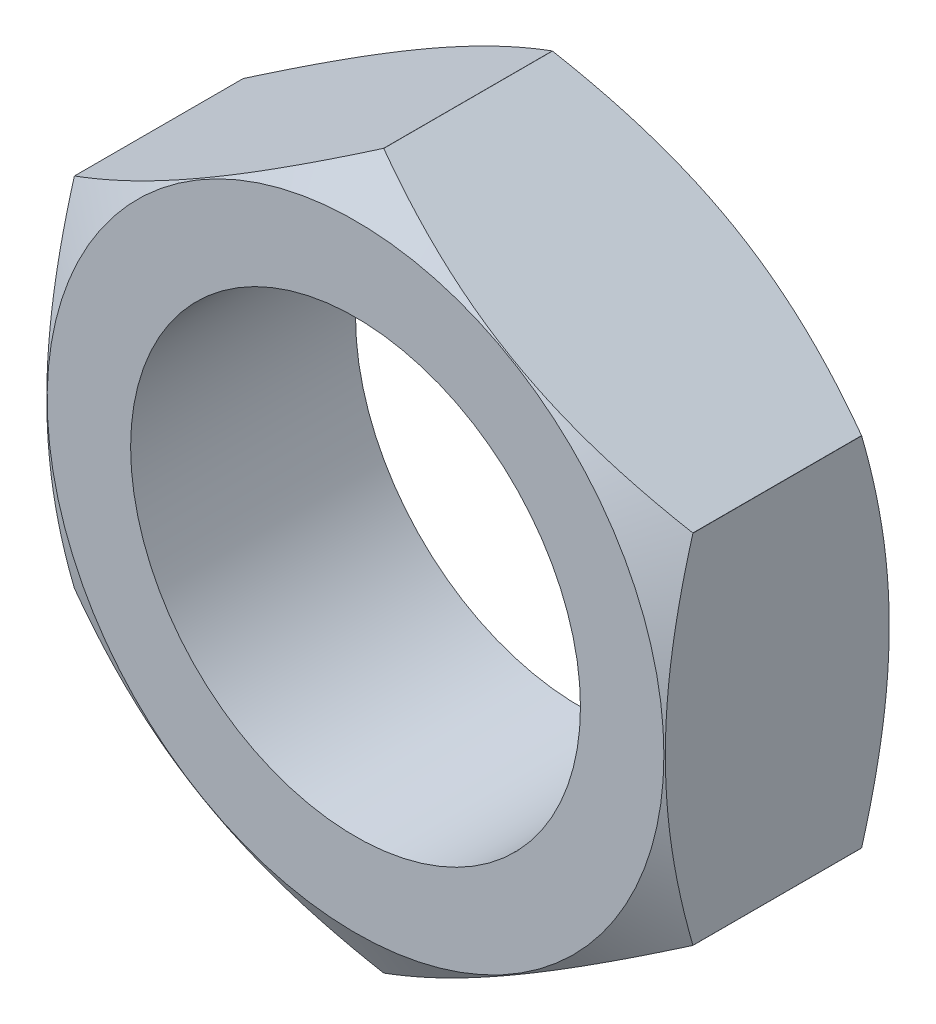
ISO-10303-21;
HEADER;
FILE_DESCRIPTION(('STEP AP214'),'2;1');
FILE_NAME('part.step','',(''),(''),'','','');
FILE_SCHEMA(('AUTOMOTIVE_DESIGN { 1 0 10303 214 1 1 1 1 }'));
ENDSEC;
DATA;
#1=APPLICATION_CONTEXT('core data for automotive mechanical design processes');
#2=APPLICATION_PROTOCOL_DEFINITION('international standard','automotive_design',2000,#1);
#3=PRODUCT_CONTEXT('',#1,'mechanical');
#4=PRODUCT('Part','Part','',(#3));
#5=PRODUCT_RELATED_PRODUCT_CATEGORY('part','',(#4));
#6=PRODUCT_DEFINITION_FORMATION('','',#4);
#7=PRODUCT_DEFINITION_CONTEXT('part definition',#1,'design');
#8=PRODUCT_DEFINITION('design','',#6,#7);
#9=PRODUCT_DEFINITION_SHAPE('','',#8);
#10=(LENGTH_UNIT() NAMED_UNIT(*) SI_UNIT(.MILLI.,.METRE.));
#11=(NAMED_UNIT(*) PLANE_ANGLE_UNIT() SI_UNIT($,.RADIAN.));
#12=(NAMED_UNIT(*) SI_UNIT($,.STERADIAN.) SOLID_ANGLE_UNIT());
#13=UNCERTAINTY_MEASURE_WITH_UNIT(LENGTH_MEASURE(1.E-05),#10,'distance_accuracy_value','');
#14=(GEOMETRIC_REPRESENTATION_CONTEXT(3) GLOBAL_UNCERTAINTY_ASSIGNED_CONTEXT((#13)) GLOBAL_UNIT_ASSIGNED_CONTEXT((#10,
#11,#12)) REPRESENTATION_CONTEXT('',''));
#15=CARTESIAN_POINT('',(0.,0.,0.));
#16=DIRECTION('',(0.,0.,1.));
#17=DIRECTION('',(1.,0.,0.));
#18=AXIS2_PLACEMENT_3D('',#15,#16,#17);
#19=CARTESIAN_POINT('',(0.,0.,4.));
#20=DIRECTION('',(0.,0.,-1.));
#21=DIRECTION('',(-1.,0.,0.));
#22=AXIS2_PLACEMENT_3D('',#19,#20,#21);
#23=CYLINDRICAL_SURFACE('',#22,6.35);
#24=DIRECTION('',(0.,0.,-1.));
#25=VECTOR('',#24,1.);
#26=CARTESIAN_POINT('',(0.00147766972870235,-6.34999982807025,4.));
#27=LINE('',#26,#25);
#28=CARTESIAN_POINT('',(0.00147766972870077,-6.34999982807025,3.49999999999999));
#29=VERTEX_POINT('',#28);
#30=CARTESIAN_POINT('',(0.00147766972870235,-6.34999982807025,0.500000000000006));
#31=VERTEX_POINT('',#30);
#32=EDGE_CURVE('E146',#29,#31,#27,.T.);
#33=ORIENTED_EDGE('',*,*,#32,.F.);
#34=CARTESIAN_POINT('',(0.,0.,3.49999999999999));
#35=DIRECTION('',(0.,0.,1.));
#36=DIRECTION('',(1.,0.,0.));
#37=AXIS2_PLACEMENT_3D('',#34,#35,#36);
#38=CIRCLE('',#37,6.35);
#39=CARTESIAN_POINT('',(-0.00147766972869454,-6.34999982807025,3.49999999999999));
#40=VERTEX_POINT('',#39);
#41=EDGE_CURVE('E135',#29,#40,#38,.F.);
#42=ORIENTED_EDGE('',*,*,#41,.T.);
#43=DIRECTION('',(0.,0.,-1.));
#44=VECTOR('',#43,1.);
#45=CARTESIAN_POINT('',(-0.00147766972869454,-6.34999982807025,4.));
#46=LINE('',#45,#44);
#47=CARTESIAN_POINT('',(-0.00147766972869454,-6.34999982807025,0.500000000000006));
#48=VERTEX_POINT('',#47);
#49=EDGE_CURVE('E420',#48,#40,#46,.F.);
#50=ORIENTED_EDGE('',*,*,#49,.F.);
#51=CARTESIAN_POINT('',(0.,0.,0.500000000000006));
#52=DIRECTION('',(0.,0.,1.));
#53=DIRECTION('',(1.,0.,0.));
#54=AXIS2_PLACEMENT_3D('',#51,#52,#53);
#55=CIRCLE('',#54,6.35);
#56=EDGE_CURVE('E134',#48,#31,#55,.T.);
#57=ORIENTED_EDGE('',*,*,#56,.T.);
#58=EDGE_LOOP('',(#33,#42,#50,#57));
#59=FACE_BOUND('',#58,.T.);
#60=ADVANCED_FACE('F17',(#59),#23,.T.);
#61=DIRECTION('',(0.,0.,-1.));
#62=VECTOR('',#61,1.);
#63=CARTESIAN_POINT('',(5.4985223302713,-3.17627961355859,4.));
#64=LINE('',#63,#62);
#65=CARTESIAN_POINT('',(5.4985223302713,-3.17627961355859,0.500000000000006));
#66=VERTEX_POINT('',#65);
#67=CARTESIAN_POINT('',(5.4985223302713,-3.17627961355858,3.49999999999999));
#68=VERTEX_POINT('',#67);
#69=EDGE_CURVE('E155',#66,#68,#64,.F.);
#70=ORIENTED_EDGE('',*,*,#69,.F.);
#71=CARTESIAN_POINT('',(5.5,-3.17372021451167,0.500000000000006));
#72=VERTEX_POINT('',#71);
#73=EDGE_CURVE('E128',#66,#72,#55,.T.);
#74=ORIENTED_EDGE('',*,*,#73,.T.);
#75=DIRECTION('',(0.,0.,-1.));
#76=VECTOR('',#75,1.);
#77=CARTESIAN_POINT('',(5.5,-3.17372021451167,4.));
#78=LINE('',#77,#76);
#79=CARTESIAN_POINT('',(5.5,-3.17372021451167,3.49999999999999));
#80=VERTEX_POINT('',#79);
#81=EDGE_CURVE('E115',#80,#72,#78,.T.);
#82=ORIENTED_EDGE('',*,*,#81,.F.);
#83=EDGE_CURVE('E130',#80,#68,#38,.F.);
#84=ORIENTED_EDGE('',*,*,#83,.T.);
#85=EDGE_LOOP('',(#70,#74,#82,#84));
#86=FACE_BOUND('',#85,.T.);
#87=ADVANCED_FACE('F122',(#86),#23,.T.);
#88=DIRECTION('',(0.,0.,-1.));
#89=VECTOR('',#88,1.);
#90=CARTESIAN_POINT('',(-5.4985223302713,-3.17627961355858,4.));
#91=LINE('',#90,#89);
#92=CARTESIAN_POINT('',(-5.4985223302713,-3.17627961355858,3.49999999999999));
#93=VERTEX_POINT('',#92);
#94=CARTESIAN_POINT('',(-5.4985223302713,-3.17627961355858,0.500000000000006));
#95=VERTEX_POINT('',#94);
#96=EDGE_CURVE('E272',#93,#95,#91,.T.);
#97=ORIENTED_EDGE('',*,*,#96,.F.);
#98=CARTESIAN_POINT('',(-5.5,-3.17372021451167,3.49999999999999));
#99=VERTEX_POINT('',#98);
#100=EDGE_CURVE('E137',#93,#99,#38,.F.);
#101=ORIENTED_EDGE('',*,*,#100,.T.);
#102=DIRECTION('',(0.,0.,-1.));
#103=VECTOR('',#102,1.);
#104=CARTESIAN_POINT('',(-5.5,-3.17372021451167,4.));
#105=LINE('',#104,#103);
#106=CARTESIAN_POINT('',(-5.5,-3.17372021451167,0.500000000000006));
#107=VERTEX_POINT('',#106);
#108=EDGE_CURVE('E217',#107,#99,#105,.F.);
#109=ORIENTED_EDGE('',*,*,#108,.F.);
#110=EDGE_CURVE('E426',#107,#95,#55,.T.);
#111=ORIENTED_EDGE('',*,*,#110,.T.);
#112=EDGE_LOOP('',(#97,#101,#109,#111));
#113=FACE_BOUND('',#112,.T.);
#114=ADVANCED_FACE('F190',(#113),#23,.T.);
#115=DIRECTION('',(0.,0.,-1.));
#116=VECTOR('',#115,1.);
#117=CARTESIAN_POINT('',(-5.5,3.17372021451167,4.));
#118=LINE('',#117,#116);
#119=CARTESIAN_POINT('',(-5.5,3.17372021451167,3.49999999999999));
#120=VERTEX_POINT('',#119);
#121=CARTESIAN_POINT('',(-5.5,3.17372021451167,0.500000000000006));
#122=VERTEX_POINT('',#121);
#123=EDGE_CURVE('E409',#120,#122,#118,.T.);
#124=ORIENTED_EDGE('',*,*,#123,.F.);
#125=CARTESIAN_POINT('',(-5.4985223302713,3.17627961355858,3.49999999999999));
#126=VERTEX_POINT('',#125);
#127=EDGE_CURVE('E148',#120,#126,#38,.F.);
#128=ORIENTED_EDGE('',*,*,#127,.T.);
#129=DIRECTION('',(0.,0.,-1.));
#130=VECTOR('',#129,1.);
#131=CARTESIAN_POINT('',(-5.4985223302713,3.17627961355858,4.));
#132=LINE('',#131,#130);
#133=CARTESIAN_POINT('',(-5.4985223302713,3.17627961355858,0.500000000000006));
#134=VERTEX_POINT('',#133);
#135=EDGE_CURVE('E216',#134,#126,#132,.F.);
#136=ORIENTED_EDGE('',*,*,#135,.F.);
#137=EDGE_CURVE('E416',#134,#122,#55,.T.);
#138=ORIENTED_EDGE('',*,*,#137,.T.);
#139=EDGE_LOOP('',(#124,#128,#136,#138));
#140=FACE_BOUND('',#139,.T.);
#141=ADVANCED_FACE('F198',(#140),#23,.T.);
#142=DIRECTION('',(0.,0.,-1.));
#143=VECTOR('',#142,1.);
#144=CARTESIAN_POINT('',(-0.00147766972869888,6.34999982807025,4.));
#145=LINE('',#144,#143);
#146=CARTESIAN_POINT('',(-0.00147766972869848,6.34999982807025,3.49999999999999));
#147=VERTEX_POINT('',#146);
#148=CARTESIAN_POINT('',(-0.00147766972869888,6.34999982807025,0.500000000000006));
#149=VERTEX_POINT('',#148);
#150=EDGE_CURVE('E211',#147,#149,#145,.T.);
#151=ORIENTED_EDGE('',*,*,#150,.F.);
#152=CARTESIAN_POINT('',(0.00147766972869454,6.34999982807025,3.49999999999999));
#153=VERTEX_POINT('',#152);
#154=EDGE_CURVE('E143',#147,#153,#38,.F.);
#155=ORIENTED_EDGE('',*,*,#154,.T.);
#156=DIRECTION('',(0.,0.,-1.));
#157=VECTOR('',#156,1.);
#158=CARTESIAN_POINT('',(0.00147766972869454,6.34999982807025,4.));
#159=LINE('',#158,#157);
#160=CARTESIAN_POINT('',(0.00147766972869454,6.34999982807025,0.500000000000006));
#161=VERTEX_POINT('',#160);
#162=EDGE_CURVE('E46',#161,#153,#159,.F.);
#163=ORIENTED_EDGE('',*,*,#162,.F.);
#164=EDGE_CURVE('E215',#161,#149,#55,.T.);
#165=ORIENTED_EDGE('',*,*,#164,.T.);
#166=EDGE_LOOP('',(#151,#155,#163,#165));
#167=FACE_BOUND('',#166,.T.);
#168=ADVANCED_FACE('F189',(#167),#23,.T.);
#169=DIRECTION('',(0.,0.,-1.));
#170=VECTOR('',#169,1.);
#171=CARTESIAN_POINT('',(5.4985223302713,3.17627961355858,4.));
#172=LINE('',#171,#170);
#173=CARTESIAN_POINT('',(5.4985223302713,3.17627961355858,3.49999999999999));
#174=VERTEX_POINT('',#173);
#175=CARTESIAN_POINT('',(5.4985223302713,3.17627961355858,0.500000000000006));
#176=VERTEX_POINT('',#175);
#177=EDGE_CURVE('E200',#174,#176,#172,.T.);
#178=ORIENTED_EDGE('',*,*,#177,.F.);
#179=CARTESIAN_POINT('',(5.5,3.17372021451167,3.49999999999999));
#180=VERTEX_POINT('',#179);
#181=EDGE_CURVE('E133',#174,#180,#38,.F.);
#182=ORIENTED_EDGE('',*,*,#181,.T.);
#183=DIRECTION('',(0.,0.,-1.));
#184=VECTOR('',#183,1.);
#185=CARTESIAN_POINT('',(5.5,3.17372021451167,4.));
#186=LINE('',#185,#184);
#187=CARTESIAN_POINT('',(5.5,3.17372021451167,0.500000000000006));
#188=VERTEX_POINT('',#187);
#189=EDGE_CURVE('E36',#188,#180,#186,.F.);
#190=ORIENTED_EDGE('',*,*,#189,.F.);
#191=EDGE_CURVE('E140',#188,#176,#55,.T.);
#192=ORIENTED_EDGE('',*,*,#191,.T.);
#193=EDGE_LOOP('',(#178,#182,#190,#192));
#194=FACE_BOUND('',#193,.T.);
#195=ADVANCED_FACE('F181',(#194),#23,.T.);
#196=CARTESIAN_POINT('',(0.,0.,0.500000000000006));
#197=DIRECTION('',(0.,0.,1.));
#198=DIRECTION('',(1.,0.,0.));
#199=AXIS2_PLACEMENT_3D('',#196,#197,#198);
#200=CONICAL_SURFACE('',#199,6.35,1.0471975511966);
#201=CARTESIAN_POINT('',(0.,0.,0.));
#202=DIRECTION('',(0.,0.,1.));
#203=DIRECTION('',(1.,0.,0.));
#204=AXIS2_PLACEMENT_3D('',#201,#202,#203);
#205=CIRCLE('',#204,5.48397459621554);
#206=CARTESIAN_POINT('',(5.48397459621554,0.,0.));
#207=VERTEX_POINT('',#206);
#208=EDGE_CURVE('E428',#207,#207,#205,.F.);
#209=ORIENTED_EDGE('',*,*,#208,.F.);
#210=EDGE_LOOP('',(#209));
#211=FACE_BOUND('',#210,.T.);
#212=ORIENTED_EDGE('',*,*,#73,.F.);
#213=CARTESIAN_POINT('',(5.49912252305866,-3.17593309209124,0.500200000000006));
#214=CARTESIAN_POINT('',(5.37823506459083,-3.24572749877928,0.459921594458649));
#215=CARTESIAN_POINT('',(5.25689688966094,-3.31578212673803,0.421472165140595));
#216=CARTESIAN_POINT('',(5.01323525433643,-3.45646023748383,0.348734844568007));
#217=CARTESIAN_POINT('',(4.89091139300029,-3.52708395175456,0.314448748475703));
#218=CARTESIAN_POINT('',(4.52198214569798,-3.74008535199647,0.218508857697959));
#219=CARTESIAN_POINT('',(4.27392077304871,-3.88330365227108,0.163945066799548));
#220=CARTESIAN_POINT('',(3.90270154624949,-4.09762717279197,0.0999728115078359));
#221=CARTESIAN_POINT('',(3.78065216269502,-4.16809241724157,0.0817509883037739));
#222=CARTESIAN_POINT('',(3.5360024162994,-4.30934101418026,0.0512005811077851));
#223=CARTESIAN_POINT('',(3.41340210309563,-4.38012433801119,0.0388714765320195));
#224=CARTESIAN_POINT('',(3.16798899368847,-4.52181366279007,0.0204207101448712));
#225=CARTESIAN_POINT('',(3.04517659732338,-4.59271943289128,0.014292009539232));
#226=CARTESIAN_POINT('',(2.79944570505017,-4.73459222969343,0.00836685498942258));
#227=CARTESIAN_POINT('',(2.67652721254751,-4.80555925442822,0.00857020484392063));
#228=CARTESIAN_POINT('',(2.33992770965881,-4.99989506803011,0.0178262287106201));
#229=CARTESIAN_POINT('',(2.12635727441137,-5.12320001631116,0.0333127335094346));
#230=CARTESIAN_POINT('',(1.70063445369626,-5.3689912014512,0.0823861477193929));
#231=CARTESIAN_POINT('',(1.488483560794,-5.49147657657714,0.115989768144951));
#232=CARTESIAN_POINT('',(1.06190649750438,-5.73776095889752,0.199975778482732));
#233=CARTESIAN_POINT('',(0.847534041223447,-5.86152895423816,0.250713386181141));
#234=CARTESIAN_POINT('',(0.421982572343092,-6.10722120935027,0.365862640063643));
#235=CARTESIAN_POINT('',(0.210798126971003,-6.22914860573451,0.430247306982216));
#236=CARTESIAN_POINT('',(0.00113096177612026,-6.3502,0.500115528199573));
#237=B_SPLINE_CURVE_WITH_KNOTS('',3,(#213,#214,#215,#216,#217,#218,#219,#220,#221,#222,#223,
#224,#225,#226,#227,#228,#229,#230,#231,#232,#233,#234,#235,#236),.UNSPECIFIED.,.F.,.F.,(4,2,2,
2,2,2,2,2,2,2,2,4),(0.,0.435816629854613,0.871820514524111,1.74563788018205,2.17184920882388,
2.59802287746971,3.02371220248434,3.44938833734359,4.18989975358119,4.93109538034512,
5.68871114353254,6.44484289530137),.UNSPECIFIED.);
#238=EDGE_CURVE('E142',#66,#31,#237,.T.);
#239=ORIENTED_EDGE('',*,*,#238,.T.);
#240=ORIENTED_EDGE('',*,*,#56,.F.);
#241=CARTESIAN_POINT('',(-0.0011309617761121,-6.3502,0.500115528199573));
#242=CARTESIAN_POINT('',(-0.122016368776213,-6.28040677772739,0.459840591390374));
#243=CARTESIAN_POINT('',(-0.243352482344903,-6.21035333989609,0.42139471782222));
#244=CARTESIAN_POINT('',(-0.48700995192687,-6.06967763424288,0.348664670156931));
#245=CARTESIAN_POINT('',(-0.609331708861156,-5.99905513494912,0.314382291279294));
#246=CARTESIAN_POINT('',(-0.978254415580985,-5.78605751091426,0.21845381810542));
#247=CARTESIAN_POINT('',(-1.22631125378102,-5.64284182860514,0.163897937715812));
#248=CARTESIAN_POINT('',(-1.59752346860563,-5.42852235644967,0.0999375309579163));
#249=CARTESIAN_POINT('',(-1.71957056267996,-5.35805843383205,0.0817196006861491));
#250=CARTESIAN_POINT('',(-1.96421559730708,-5.21681255723418,0.051176934635899));
#251=CARTESIAN_POINT('',(-2.08681348823781,-5.14603063190324,0.0388516783141732));
#252=CARTESIAN_POINT('',(-2.33222162846296,-5.00434417608292,0.0204084655525005));
#253=CARTESIAN_POINT('',(-2.4550314781342,-4.9334398763161,0.0142834713608713));
#254=CARTESIAN_POINT('',(-2.70075713706276,-4.79157010098689,0.00836549531790692));
#255=CARTESIAN_POINT('',(-2.82367294292034,-4.72060462738736,0.00857231734804156));
#256=CARTESIAN_POINT('',(-3.16027498429178,-4.52626734819178,0.0178376874579405));
#257=CARTESIAN_POINT('',(-3.37385050129747,-4.40295946595623,0.0333306439669602));
#258=CARTESIAN_POINT('',(-3.7995830761955,-4.15716264923606,0.0824172875984413));
#259=CARTESIAN_POINT('',(-4.01173864103491,-4.03467457676596,0.116027687077426));
#260=CARTESIAN_POINT('',(-4.43832495377652,-3.78838485427197,0.200027318636887));
#261=CARTESIAN_POINT('',(-4.65270197903326,-3.66461422103193,0.250771775489718));
#262=CARTESIAN_POINT('',(-5.07826232549702,-3.41891684044464,0.365934381996215));
#263=CARTESIAN_POINT('',(-5.28945108053579,-3.29698695587319,0.430325549695916));
#264=CARTESIAN_POINT('',(-5.49912252305866,-3.17593309209123,0.500200000000006));
#265=B_SPLINE_CURVE_WITH_KNOTS('',3,(#241,#242,#243,#244,#245,#246,#247,#248,#249,#250,#251,
#252,#253,#254,#255,#256,#257,#258,#259,#260,#261,#262,#263,#264),.UNSPECIFIED.,.F.,.F.,(4,2,2,
2,2,2,2,2,2,2,2,4),(0.,0.435806915322628,0.871801080098848,1.74559852998634,2.17180049538229,
2.59796480426339,3.02364484119705,3.44931169334205,4.18984185557171,4.93105628852627,
5.68869170671136,6.44484289260522),.UNSPECIFIED.);
#266=EDGE_CURVE('E266',#48,#95,#265,.T.);
#267=ORIENTED_EDGE('',*,*,#266,.T.);
#268=ORIENTED_EDGE('',*,*,#110,.F.);
#269=CARTESIAN_POINT('',(-5.5,-8.42034745246126,2.64049584097507));
#270=CARTESIAN_POINT('',(-5.5,-8.17887687276858,2.52380953124203));
#271=CARTESIAN_POINT('',(-5.5,-7.93683522215109,2.40828359479318));
#272=CARTESIAN_POINT('',(-5.5,-7.45130099862284,2.18021557605144));
#273=CARTESIAN_POINT('',(-5.5,-7.20780818317874,2.06767401069827));
#274=CARTESIAN_POINT('',(-5.5,-6.71774685366975,1.84564467164147));
#275=CARTESIAN_POINT('',(-5.5,-6.471168711707,1.73617807181734));
#276=CARTESIAN_POINT('',(-5.5,-5.97598525870113,1.52194867953462));
#277=CARTESIAN_POINT('',(-5.5,-5.7273800541754,1.41718564177322));
#278=CARTESIAN_POINT('',(-5.5,-5.22466719513361,1.21237298920825));
#279=CARTESIAN_POINT('',(-5.5,-4.97052944279241,1.11239684558171));
#280=CARTESIAN_POINT('',(-5.5,-4.45925568652989,0.920278098521693));
#281=CARTESIAN_POINT('',(-5.5,-4.20211935257866,0.828136366791568));
#282=CARTESIAN_POINT('',(-5.5,-3.68496883896911,0.654162997928254));
#283=CARTESIAN_POINT('',(-5.5,-3.42496211182227,0.572309429823538));
#284=CARTESIAN_POINT('',(-5.5,-2.90124969587028,0.421572555597366));
#285=CARTESIAN_POINT('',(-5.5,-2.63754520567204,0.352685146435));
#286=CARTESIAN_POINT('',(-5.5,-2.10626929542919,0.231222070262913));
#287=CARTESIAN_POINT('',(-5.5,-1.83869684918393,0.178650818387478));
#288=CARTESIAN_POINT('',(-5.5,-1.30028999516077,0.09337402069529));
#289=CARTESIAN_POINT('',(-5.5,-1.02945558425374,0.0606684939368347));
#290=CARTESIAN_POINT('',(-5.5,-0.622773782446214,0.0286061142408871));
#291=CARTESIAN_POINT('',(-5.5,-0.487562137372784,0.0207496364948722));
#292=CARTESIAN_POINT('',(-5.5,-0.216921266971526,0.0107659928481684));
#293=CARTESIAN_POINT('',(-5.5,-0.0814920444864421,0.00863875269190475));
#294=CARTESIAN_POINT('',(-5.5,0.189294508030929,0.010170764308374));
#295=CARTESIAN_POINT('',(-5.5,0.3246518475739,0.0138283937865548));
#296=CARTESIAN_POINT('',(-5.5,0.595094856523229,0.0268374926009002));
#297=CARTESIAN_POINT('',(-5.5,0.730180512049955,0.0361892457760574));
#298=CARTESIAN_POINT('',(-5.5,1.05762985893361,0.0655649968491082));
#299=CARTESIAN_POINT('',(-5.5,1.24974151694664,0.0884446045831098));
#300=CARTESIAN_POINT('',(-5.5,1.63249183542192,0.144450538398782));
#301=CARTESIAN_POINT('',(-5.5,1.82313007909898,0.177579662327816));
#302=CARTESIAN_POINT('',(-5.5,2.20277653625773,0.252909686019042));
#303=CARTESIAN_POINT('',(-5.5,2.3917830308213,0.295119166555119));
#304=CARTESIAN_POINT('',(-5.5,2.76785098793643,0.387322105324511));
#305=CARTESIAN_POINT('',(-5.5,2.95491263198975,0.437314830108411));
#306=CARTESIAN_POINT('',(-5.5,3.33169630055404,0.545194591945612));
#307=CARTESIAN_POINT('',(-5.5,3.52137121520042,0.603245036064068));
#308=CARTESIAN_POINT('',(-5.5,3.89871614781724,0.725078762084823));
#309=CARTESIAN_POINT('',(-5.5,4.08638745044699,0.788858088737562));
#310=CARTESIAN_POINT('',(-5.5,4.45897207572575,0.920832397155855));
#311=CARTESIAN_POINT('',(-5.5,4.64389497698282,0.989000498933315));
#312=CARTESIAN_POINT('',(-5.5,5.01230627940201,1.12933592285498));
#313=CARTESIAN_POINT('',(-5.5,5.19579406564921,1.20150486248735));
#314=CARTESIAN_POINT('',(-5.5,5.37861538793253,1.27527838678694));
#315=B_SPLINE_CURVE_WITH_KNOTS('',3,(#269,#270,#271,#272,#273,#274,#275,#276,#277,#278,#279,
#280,#281,#282,#283,#284,#285,#286,#287,#288,#289,#290,#291,#292,#293,#294,#295,#296,#297,#298,
#299,#300,#301,#302,#303,#304,#305,#306,#307,#308,#309,#310,#311,#312,#313,#314),.UNSPECIFIED.,
.F.,.F.,(4,2,2,2,2,2,2,2,2,2,2,2,2,2,2,2,2,2,2,2,2,2,4),(0.,0.804568839123964,1.60927614367266,
2.41859082415749,3.22786324766219,4.04705045247993,4.86632868599399,5.68382975102874,
6.50107168763791,7.31853457659554,8.13599824978963,8.54221423681059,8.94842495891692,
9.35452178448915,9.76063885471315,10.3407235440357,10.9209667210885,11.5017606451894,
12.0824998716092,12.6774676941367,13.2720278596077,13.8632408548458,14.4546946382964),.UNSPECIFIED.);
#316=EDGE_CURVE('E406',#107,#122,#315,.T.);
#317=ORIENTED_EDGE('',*,*,#316,.T.);
#318=ORIENTED_EDGE('',*,*,#137,.F.);
#319=CARTESIAN_POINT('',(-5.49912252305866,3.17593309209123,0.500200000000007));
#320=CARTESIAN_POINT('',(-5.37823506459084,3.24572749877928,0.459921594458649));
#321=CARTESIAN_POINT('',(-5.25689688966095,3.31578212673803,0.421472165140596));
#322=CARTESIAN_POINT('',(-5.01323525433643,3.45646023748382,0.348734844568007));
#323=CARTESIAN_POINT('',(-4.89091139300029,3.52708395175456,0.314448748475703));
#324=CARTESIAN_POINT('',(-4.52198214569799,3.74008535199647,0.218508857697959));
#325=CARTESIAN_POINT('',(-4.27392077304872,3.88330365227107,0.163945066799547));
#326=CARTESIAN_POINT('',(-3.90270154624949,4.09762717279197,0.0999728115078352));
#327=CARTESIAN_POINT('',(-3.78065216269503,4.16809241724157,0.0817509883037733));
#328=CARTESIAN_POINT('',(-3.53600241629941,4.30934101418026,0.0512005811077842));
#329=CARTESIAN_POINT('',(-3.41340210309563,4.38012433801119,0.0388714765320183));
#330=CARTESIAN_POINT('',(-3.16798899368848,4.52181366279007,0.02042071014487));
#331=CARTESIAN_POINT('',(-3.04517659732338,4.59271943289128,0.014292009539231));
#332=CARTESIAN_POINT('',(-2.79944570505017,4.73459222969342,0.00836685498942163));
#333=CARTESIAN_POINT('',(-2.67652721254751,4.80555925442822,0.00857020484391947));
#334=CARTESIAN_POINT('',(-2.33992770965881,4.99989506803011,0.0178262287106187));
#335=CARTESIAN_POINT('',(-2.12635727441137,5.12320001631116,0.0333127335094334));
#336=CARTESIAN_POINT('',(-1.70063445369627,5.36899120145119,0.082386147719392));
#337=CARTESIAN_POINT('',(-1.488483560794,5.49147657657714,0.11598976814495));
#338=CARTESIAN_POINT('',(-1.06190649750438,5.73776095889752,0.19997577848273));
#339=CARTESIAN_POINT('',(-0.847534041223447,5.86152895423816,0.25071338618114));
#340=CARTESIAN_POINT('',(-0.42198257234309,6.10722120935027,0.365862640063643));
#341=CARTESIAN_POINT('',(-0.210798126971001,6.22914860573451,0.430247306982216));
#342=CARTESIAN_POINT('',(-0.00113096177611733,6.3502,0.500115528199573));
#343=B_SPLINE_CURVE_WITH_KNOTS('',3,(#319,#320,#321,#322,#323,#324,#325,#326,#327,#328,#329,
#330,#331,#332,#333,#334,#335,#336,#337,#338,#339,#340,#341,#342),.UNSPECIFIED.,.F.,.F.,(4,2,2,
2,2,2,2,2,2,2,2,4),(0.,0.435816629854613,0.871820514524111,1.74563788018205,2.17184920882388,
2.59802287746971,3.02371220248434,3.44938833734359,4.1898997535812,4.93109538034513,
5.68871114353254,6.44484289530137),.UNSPECIFIED.);
#344=EDGE_CURVE('E214',#134,#149,#343,.T.);
#345=ORIENTED_EDGE('',*,*,#344,.T.);
#346=ORIENTED_EDGE('',*,*,#164,.F.);
#347=CARTESIAN_POINT('',(0.00113096177611536,6.3502,0.500115528199573));
#348=CARTESIAN_POINT('',(0.122016368776217,6.28040677772739,0.459840591390374));
#349=CARTESIAN_POINT('',(0.243352482344907,6.21035333989609,0.421394717822219));
#350=CARTESIAN_POINT('',(0.487009951926874,6.06967763424288,0.348664670156931));
#351=CARTESIAN_POINT('',(0.60933170886116,5.99905513494912,0.314382291279295));
#352=CARTESIAN_POINT('',(0.978254415580988,5.78605751091426,0.21845381810542));
#353=CARTESIAN_POINT('',(1.22631125378102,5.64284182860514,0.163897937715811));
#354=CARTESIAN_POINT('',(1.59752346860564,5.42852235644967,0.0999375309579164));
#355=CARTESIAN_POINT('',(1.71957056267996,5.35805843383205,0.0817196006861498));
#356=CARTESIAN_POINT('',(1.96421559730709,5.21681255723418,0.0511769346359));
#357=CARTESIAN_POINT('',(2.08681348823782,5.14603063190324,0.0388516783141739));
#358=CARTESIAN_POINT('',(2.33222162846296,5.00434417608292,0.0204084655525013));
#359=CARTESIAN_POINT('',(2.4550314781342,4.9334398763161,0.0142834713608725));
#360=CARTESIAN_POINT('',(2.70075713706277,4.79157010098689,0.00836549531790811));
#361=CARTESIAN_POINT('',(2.82367294292034,4.72060462738736,0.00857231734804233));
#362=CARTESIAN_POINT('',(3.16027498429178,4.52626734819178,0.0178376874579408));
#363=CARTESIAN_POINT('',(3.37385050129747,4.40295946595623,0.033330643966961));
#364=CARTESIAN_POINT('',(3.7995830761955,4.15716264923606,0.0824172875984421));
#365=CARTESIAN_POINT('',(4.01173864103491,4.03467457676596,0.116027687077427));
#366=CARTESIAN_POINT('',(4.43832495377652,3.78838485427197,0.200027318636887));
#367=CARTESIAN_POINT('',(4.65270197903326,3.66461422103193,0.250771775489718));
#368=CARTESIAN_POINT('',(5.07826232549702,3.41891684044464,0.365934381996215));
#369=CARTESIAN_POINT('',(5.28945108053579,3.29698695587319,0.430325549695916));
#370=CARTESIAN_POINT('',(5.49912252305866,3.17593309209123,0.500200000000006));
#371=B_SPLINE_CURVE_WITH_KNOTS('',3,(#347,#348,#349,#350,#351,#352,#353,#354,#355,#356,#357,
#358,#359,#360,#361,#362,#363,#364,#365,#366,#367,#368,#369,#370),.UNSPECIFIED.,.F.,.F.,(4,2,2,
2,2,2,2,2,2,2,2,4),(0.,0.435806915322628,0.871801080098849,1.74559852998634,2.17180049538229,
2.59796480426339,3.02364484119705,3.44931169334205,4.1898418555717,4.93105628852627,
5.68869170671136,6.44484289260522),.UNSPECIFIED.);
#372=EDGE_CURVE('E205',#161,#176,#371,.T.);
#373=ORIENTED_EDGE('',*,*,#372,.T.);
#374=ORIENTED_EDGE('',*,*,#191,.F.);
#375=CARTESIAN_POINT('',(5.5,-8.42034745246126,2.64049584097508));
#376=CARTESIAN_POINT('',(5.5,-8.17887687276858,2.52380953124204));
#377=CARTESIAN_POINT('',(5.5,-7.93683522215109,2.40828359479318));
#378=CARTESIAN_POINT('',(5.5,-7.45130099862285,2.18021557605144));
#379=CARTESIAN_POINT('',(5.5,-7.20780818317875,2.06767401069827));
#380=CARTESIAN_POINT('',(5.5,-6.71774685366975,1.84564467164147));
#381=CARTESIAN_POINT('',(5.5,-6.471168711707,1.73617807181734));
#382=CARTESIAN_POINT('',(5.5,-5.97598525870113,1.52194867953462));
#383=CARTESIAN_POINT('',(5.5,-5.7273800541754,1.41718564177322));
#384=CARTESIAN_POINT('',(5.5,-5.22466719513362,1.21237298920825));
#385=CARTESIAN_POINT('',(5.5,-4.97052944279241,1.11239684558171));
#386=CARTESIAN_POINT('',(5.5,-4.45925568652989,0.920278098521694));
#387=CARTESIAN_POINT('',(5.5,-4.20211935257866,0.828136366791569));
#388=CARTESIAN_POINT('',(5.5,-3.68496883896911,0.654162997928255));
#389=CARTESIAN_POINT('',(5.5,-3.42496211182227,0.572309429823538));
#390=CARTESIAN_POINT('',(5.5,-2.90124969587028,0.421572555597367));
#391=CARTESIAN_POINT('',(5.5,-2.63754520567204,0.352685146435001));
#392=CARTESIAN_POINT('',(5.5,-2.10626929542919,0.231222070262914));
#393=CARTESIAN_POINT('',(5.5,-1.83869684918393,0.178650818387479));
#394=CARTESIAN_POINT('',(5.5,-1.30028999516078,0.0933740206952909));
#395=CARTESIAN_POINT('',(5.5,-1.02945558425374,0.0606684939368359));
#396=CARTESIAN_POINT('',(5.5,-0.622773782446218,0.0286061142408878));
#397=CARTESIAN_POINT('',(5.5,-0.487562137372789,0.0207496364948726));
#398=CARTESIAN_POINT('',(5.5,-0.216921266971531,0.0107659928481687));
#399=CARTESIAN_POINT('',(5.5,-0.0814920444864467,0.00863875269190515));
#400=CARTESIAN_POINT('',(5.5,0.189294508030925,0.0101707643083742));
#401=CARTESIAN_POINT('',(5.5,0.324651847573896,0.0138283937865546));
#402=CARTESIAN_POINT('',(5.5,0.595094856523225,0.0268374926009));
#403=CARTESIAN_POINT('',(5.5,0.730180512049951,0.0361892457760575));
#404=CARTESIAN_POINT('',(5.5,1.0576298589336,0.0655649968491085));
#405=CARTESIAN_POINT('',(5.5,1.24974151694664,0.0884446045831097));
#406=CARTESIAN_POINT('',(5.5,1.63249183542192,0.144450538398782));
#407=CARTESIAN_POINT('',(5.5,1.82313007909897,0.177579662327815));
#408=CARTESIAN_POINT('',(5.5,2.20277653625773,0.252909686019041));
#409=CARTESIAN_POINT('',(5.5,2.39178303082129,0.295119166555119));
#410=CARTESIAN_POINT('',(5.5,2.76785098793643,0.387322105324511));
#411=CARTESIAN_POINT('',(5.5,2.95491263198975,0.43731483010841));
#412=CARTESIAN_POINT('',(5.5,3.33169630055404,0.545194591945611));
#413=CARTESIAN_POINT('',(5.5,3.52137121520042,0.603245036064067));
#414=CARTESIAN_POINT('',(5.5,3.89871614781723,0.725078762084822));
#415=CARTESIAN_POINT('',(5.5,4.08638745044699,0.788858088737561));
#416=CARTESIAN_POINT('',(5.5,4.45897207572575,0.920832397155855));
#417=CARTESIAN_POINT('',(5.5,4.64389497698282,0.989000498933314));
#418=CARTESIAN_POINT('',(5.5,5.01230627940201,1.12933592285497));
#419=CARTESIAN_POINT('',(5.5,5.1957940656492,1.20150486248735));
#420=CARTESIAN_POINT('',(5.5,5.37861538793253,1.27527838678694));
#421=B_SPLINE_CURVE_WITH_KNOTS('',3,(#375,#376,#377,#378,#379,#380,#381,#382,#383,#384,#385,
#386,#387,#388,#389,#390,#391,#392,#393,#394,#395,#396,#397,#398,#399,#400,#401,#402,#403,#404,
#405,#406,#407,#408,#409,#410,#411,#412,#413,#414,#415,#416,#417,#418,#419,#420),.UNSPECIFIED.,
.F.,.F.,(4,2,2,2,2,2,2,2,2,2,2,2,2,2,2,2,2,2,2,2,2,2,4),(0.,0.804568839123965,1.60927614367266,
2.4185908241575,3.2278632476622,4.04705045247994,4.86632868599399,5.68382975102875,
6.50107168763791,7.31853457659555,8.13599824978963,8.5422142368106,8.94842495891693,
9.35452178448915,9.76063885471316,10.3407235440357,10.9209667210885,11.5017606451894,
12.0824998716092,12.6774676941367,13.2720278596077,13.8632408548458,14.4546946382964),.UNSPECIFIED.);
#422=EDGE_CURVE('E127',#188,#72,#421,.F.);
#423=ORIENTED_EDGE('',*,*,#422,.T.);
#424=EDGE_LOOP('',(#212,#239,#240,#267,#268,#317,#318,#345,#346,#373,#374,#423));
#425=FACE_BOUND('',#424,.T.);
#426=ADVANCED_FACE('F157',(#211,#425),#200,.T.);
#427=CARTESIAN_POINT('',(0.,0.,4.));
#428=DIRECTION('',(0.,0.,-1.));
#429=DIRECTION('',(-1.,0.,0.));
#430=AXIS2_PLACEMENT_3D('',#427,#428,#429);
#431=CONICAL_SURFACE('',#430,5.48397459621554,1.0471975511966);
#432=CARTESIAN_POINT('',(0.,0.,4.));
#433=DIRECTION('',(0.,0.,1.));
#434=DIRECTION('',(1.,0.,0.));
#435=AXIS2_PLACEMENT_3D('',#432,#433,#434);
#436=CIRCLE('',#435,5.48397459621554);
#437=CARTESIAN_POINT('',(5.48397459621554,0.,4.));
#438=VERTEX_POINT('',#437);
#439=EDGE_CURVE('E118',#438,#438,#436,.T.);
#440=ORIENTED_EDGE('',*,*,#439,.F.);
#441=EDGE_LOOP('',(#440));
#442=FACE_BOUND('',#441,.T.);
#443=ORIENTED_EDGE('',*,*,#41,.F.);
#444=CARTESIAN_POINT('',(0.00113096177612018,-6.3502,3.49988447180043));
#445=CARTESIAN_POINT('',(0.122016368776222,-6.28040677772739,3.54015940860963));
#446=CARTESIAN_POINT('',(0.243352482344912,-6.21035333989609,3.57860528217778));
#447=CARTESIAN_POINT('',(0.487009951926879,-6.06967763424288,3.65133532984307));
#448=CARTESIAN_POINT('',(0.609331708861165,-5.99905513494912,3.6856177087207));
#449=CARTESIAN_POINT('',(0.978254415580993,-5.78605751091426,3.78154618189458));
#450=CARTESIAN_POINT('',(1.22631125378103,-5.64284182860514,3.83610206228419));
#451=CARTESIAN_POINT('',(1.59752346860564,-5.42852235644967,3.90006246904208));
#452=CARTESIAN_POINT('',(1.71957056267997,-5.35805843383205,3.91828039931385));
#453=CARTESIAN_POINT('',(1.96421559730709,-5.21681255723418,3.9488230653641));
#454=CARTESIAN_POINT('',(2.08681348823782,-5.14603063190324,3.96114832168582));
#455=CARTESIAN_POINT('',(2.33222162846297,-5.00434417608292,3.9795915344475));
#456=CARTESIAN_POINT('',(2.4550314781342,-4.9334398763161,3.98571652863913));
#457=CARTESIAN_POINT('',(2.70075713706277,-4.79157010098689,3.99163450468209));
#458=CARTESIAN_POINT('',(2.82367294292035,-4.72060462738736,3.99142768265196));
#459=CARTESIAN_POINT('',(3.16027498429178,-4.52626734819178,3.98216231254206));
#460=CARTESIAN_POINT('',(3.37385050129748,-4.40295946595623,3.96666935603304));
#461=CARTESIAN_POINT('',(3.79958307619551,-4.15716264923606,3.91758271240156));
#462=CARTESIAN_POINT('',(4.01173864103491,-4.03467457676596,3.88397231292257));
#463=CARTESIAN_POINT('',(4.43832495377652,-3.78838485427198,3.79997268136311));
#464=CARTESIAN_POINT('',(4.65270197903326,-3.66461422103193,3.74922822451028));
#465=CARTESIAN_POINT('',(5.07826232549702,-3.41891684044465,3.63406561800379));
#466=CARTESIAN_POINT('',(5.28945108053578,-3.29698695587319,3.56967445030408));
#467=CARTESIAN_POINT('',(5.49912252305866,-3.17593309209124,3.49979999999999));
#468=B_SPLINE_CURVE_WITH_KNOTS('',3,(#444,#445,#446,#447,#448,#449,#450,#451,#452,#453,#454,
#455,#456,#457,#458,#459,#460,#461,#462,#463,#464,#465,#466,#467),.UNSPECIFIED.,.F.,.F.,(4,2,2,
2,2,2,2,2,2,2,2,4),(0.,0.435806915322628,0.871801080098849,1.74559852998634,2.17180049538229,
2.59796480426339,3.02364484119705,3.44931169334205,4.1898418555717,4.93105628852626,
5.68869170671135,6.44484289260521),.UNSPECIFIED.);
#469=EDGE_CURVE('E11',#29,#68,#468,.T.);
#470=ORIENTED_EDGE('',*,*,#469,.T.);
#471=ORIENTED_EDGE('',*,*,#83,.F.);
#472=CARTESIAN_POINT('',(5.5,-8.42034745246126,1.35950415902492));
#473=CARTESIAN_POINT('',(5.5,-8.17887687276858,1.47619046875796));
#474=CARTESIAN_POINT('',(5.5,-7.93683522215109,1.59171640520682));
#475=CARTESIAN_POINT('',(5.5,-7.45130099862285,1.81978442394856));
#476=CARTESIAN_POINT('',(5.5,-7.20780818317874,1.93232598930173));
#477=CARTESIAN_POINT('',(5.5,-6.71774685366975,2.15435532835853));
#478=CARTESIAN_POINT('',(5.5,-6.471168711707,2.26382192818266));
#479=CARTESIAN_POINT('',(5.5,-5.97598525870113,2.47805132046538));
#480=CARTESIAN_POINT('',(5.5,-5.7273800541754,2.58281435822678));
#481=CARTESIAN_POINT('',(5.5,-5.22466719513362,2.78762701079175));
#482=CARTESIAN_POINT('',(5.5,-4.97052944279241,2.88760315441829));
#483=CARTESIAN_POINT('',(5.5,-4.45925568652989,3.07972190147831));
#484=CARTESIAN_POINT('',(5.5,-4.20211935257866,3.17186363320843));
#485=CARTESIAN_POINT('',(5.5,-3.68496883896911,3.34583700207174));
#486=CARTESIAN_POINT('',(5.5,-3.42496211182227,3.42769057017646));
#487=CARTESIAN_POINT('',(5.5,-2.90124969587028,3.57842744440263));
#488=CARTESIAN_POINT('',(5.5,-2.63754520567204,3.647314853565));
#489=CARTESIAN_POINT('',(5.5,-2.10626929542919,3.76877792973709));
#490=CARTESIAN_POINT('',(5.5,-1.83869684918393,3.82134918161252));
#491=CARTESIAN_POINT('',(5.5,-1.30028999516077,3.90662597930471));
#492=CARTESIAN_POINT('',(5.5,-1.02945558425374,3.93933150606316));
#493=CARTESIAN_POINT('',(5.5,-0.622773782446216,3.97139388575911));
#494=CARTESIAN_POINT('',(5.5,-0.487562137372787,3.97925036350513));
#495=CARTESIAN_POINT('',(5.5,-0.216921266971529,3.98923400715183));
#496=CARTESIAN_POINT('',(5.5,-0.0814920444864448,3.99136124730809));
#497=CARTESIAN_POINT('',(5.5,0.189294508030927,3.98982923569163));
#498=CARTESIAN_POINT('',(5.5,0.324651847573898,3.98617160621344));
#499=CARTESIAN_POINT('',(5.5,0.595094856523226,3.9731625073991));
#500=CARTESIAN_POINT('',(5.5,0.730180512049952,3.96381075422394));
#501=CARTESIAN_POINT('',(5.5,1.0576298589336,3.93443500315089));
#502=CARTESIAN_POINT('',(5.5,1.24974151694664,3.91155539541689));
#503=CARTESIAN_POINT('',(5.5,1.63249183542192,3.85554946160122));
#504=CARTESIAN_POINT('',(5.5,1.82313007909897,3.82242033767218));
#505=CARTESIAN_POINT('',(5.5,2.20277653625773,3.74709031398096));
#506=CARTESIAN_POINT('',(5.5,2.39178303082129,3.70488083344488));
#507=CARTESIAN_POINT('',(5.5,2.76785098793643,3.61267789467549));
#508=CARTESIAN_POINT('',(5.5,2.95491263198975,3.56268516989159));
#509=CARTESIAN_POINT('',(5.5,3.33169630055404,3.45480540805439));
#510=CARTESIAN_POINT('',(5.5,3.52137121520042,3.39675496393593));
#511=CARTESIAN_POINT('',(5.5,3.89871614781723,3.27492123791518));
#512=CARTESIAN_POINT('',(5.5,4.08638745044698,3.21114191126244));
#513=CARTESIAN_POINT('',(5.5,4.45897207572574,3.07916760284415));
#514=CARTESIAN_POINT('',(5.5,4.64389497698281,3.01099950106669));
#515=CARTESIAN_POINT('',(5.5,5.01230627940201,2.87066407714503));
#516=CARTESIAN_POINT('',(5.5,5.1957940656492,2.79849513751265));
#517=CARTESIAN_POINT('',(5.5,5.37861538793253,2.72472161321306));
#518=B_SPLINE_CURVE_WITH_KNOTS('',3,(#472,#473,#474,#475,#476,#477,#478,#479,#480,#481,#482,
#483,#484,#485,#486,#487,#488,#489,#490,#491,#492,#493,#494,#495,#496,#497,#498,#499,#500,#501,
#502,#503,#504,#505,#506,#507,#508,#509,#510,#511,#512,#513,#514,#515,#516,#517),.UNSPECIFIED.,
.F.,.F.,(4,2,2,2,2,2,2,2,2,2,2,2,2,2,2,2,2,2,2,2,2,2,4),(0.,0.804568839123966,1.60927614367266,
2.4185908241575,3.2278632476622,4.04705045247994,4.86632868599399,5.68382975102875,
6.50107168763792,7.31853457659555,8.13599824978964,8.5422142368106,8.94842495891693,
9.35452178448915,9.76063885471316,10.3407235440357,10.9209667210885,11.5017606451894,
12.0824998716092,12.6774676941367,13.2720278596077,13.8632408548458,14.4546946382964),.UNSPECIFIED.);
#519=EDGE_CURVE('E108',#80,#180,#518,.T.);
#520=ORIENTED_EDGE('',*,*,#519,.T.);
#521=ORIENTED_EDGE('',*,*,#181,.F.);
#522=CARTESIAN_POINT('',(5.49912252305866,3.17593309209123,3.49979999999999));
#523=CARTESIAN_POINT('',(5.37823506459084,3.24572749877928,3.54007840554135));
#524=CARTESIAN_POINT('',(5.25689688966095,3.31578212673803,3.5785278348594));
#525=CARTESIAN_POINT('',(5.01323525433643,3.45646023748382,3.65126515543199));
#526=CARTESIAN_POINT('',(4.89091139300029,3.52708395175456,3.6855512515243));
#527=CARTESIAN_POINT('',(4.52198214569799,3.74008535199647,3.78149114230204));
#528=CARTESIAN_POINT('',(4.27392077304872,3.88330365227107,3.83605493320045));
#529=CARTESIAN_POINT('',(3.90270154624949,4.09762717279197,3.90002718849217));
#530=CARTESIAN_POINT('',(3.78065216269503,4.16809241724157,3.91824901169623));
#531=CARTESIAN_POINT('',(3.53600241629941,4.30934101418025,3.94879941889222));
#532=CARTESIAN_POINT('',(3.41340210309563,4.38012433801119,3.96112852346798));
#533=CARTESIAN_POINT('',(3.16798899368848,4.52181366279007,3.97957928985513));
#534=CARTESIAN_POINT('',(3.04517659732338,4.59271943289128,3.98570799046077));
#535=CARTESIAN_POINT('',(2.79944570505018,4.73459222969342,3.99163314501058));
#536=CARTESIAN_POINT('',(2.67652721254751,4.80555925442822,3.99142979515608));
#537=CARTESIAN_POINT('',(2.33992770965881,4.9998950680301,3.98217377128938));
#538=CARTESIAN_POINT('',(2.12635727441137,5.12320001631116,3.96668726649057));
#539=CARTESIAN_POINT('',(1.70063445369627,5.36899120145119,3.91761385228061));
#540=CARTESIAN_POINT('',(1.488483560794,5.49147657657714,3.88401023185505));
#541=CARTESIAN_POINT('',(1.06190649750438,5.73776095889752,3.80002422151727));
#542=CARTESIAN_POINT('',(0.847534041223446,5.86152895423816,3.74928661381886));
#543=CARTESIAN_POINT('',(0.42198257234309,6.10722120935027,3.63413735993636));
#544=CARTESIAN_POINT('',(0.210798126971,6.22914860573451,3.56975269301778));
#545=CARTESIAN_POINT('',(0.00113096177611588,6.3502,3.49988447180043));
#546=B_SPLINE_CURVE_WITH_KNOTS('',3,(#522,#523,#524,#525,#526,#527,#528,#529,#530,#531,#532,
#533,#534,#535,#536,#537,#538,#539,#540,#541,#542,#543,#544,#545),.UNSPECIFIED.,.F.,.F.,(4,2,2,
2,2,2,2,2,2,2,2,4),(0.,0.435816629854613,0.871820514524111,1.74563788018205,2.17184920882388,
2.59802287746971,3.02371220248434,3.44938833734359,4.18989975358119,4.93109538034513,
5.68871114353254,6.44484289530137),.UNSPECIFIED.);
#547=EDGE_CURVE('E119',#174,#153,#546,.T.);
#548=ORIENTED_EDGE('',*,*,#547,.T.);
#549=ORIENTED_EDGE('',*,*,#154,.F.);
#550=CARTESIAN_POINT('',(-0.00113096177611748,6.3502,3.49988447180043));
#551=CARTESIAN_POINT('',(-0.122016368776219,6.28040677772739,3.54015940860963));
#552=CARTESIAN_POINT('',(-0.243352482344909,6.21035333989609,3.57860528217778));
#553=CARTESIAN_POINT('',(-0.487009951926876,6.06967763424288,3.65133532984307));
#554=CARTESIAN_POINT('',(-0.609331708861162,5.99905513494912,3.68561770872071));
#555=CARTESIAN_POINT('',(-0.97825441558099,5.78605751091426,3.78154618189458));
#556=CARTESIAN_POINT('',(-1.22631125378102,5.64284182860514,3.83610206228419));
#557=CARTESIAN_POINT('',(-1.59752346860564,5.42852235644967,3.90006246904208));
#558=CARTESIAN_POINT('',(-1.71957056267997,5.35805843383205,3.91828039931385));
#559=CARTESIAN_POINT('',(-1.96421559730709,5.21681255723418,3.9488230653641));
#560=CARTESIAN_POINT('',(-2.08681348823782,5.14603063190324,3.96114832168583));
#561=CARTESIAN_POINT('',(-2.33222162846296,5.00434417608292,3.9795915344475));
#562=CARTESIAN_POINT('',(-2.4550314781342,4.9334398763161,3.98571652863913));
#563=CARTESIAN_POINT('',(-2.70075713706277,4.79157010098689,3.99163450468209));
#564=CARTESIAN_POINT('',(-2.82367294292035,4.72060462738736,3.99142768265196));
#565=CARTESIAN_POINT('',(-3.16027498429178,4.52626734819178,3.98216231254206));
#566=CARTESIAN_POINT('',(-3.37385050129748,4.40295946595623,3.96666935603304));
#567=CARTESIAN_POINT('',(-3.79958307619551,4.15716264923606,3.91758271240156));
#568=CARTESIAN_POINT('',(-4.01173864103491,4.03467457676596,3.88397231292257));
#569=CARTESIAN_POINT('',(-4.43832495377652,3.78838485427197,3.79997268136311));
#570=CARTESIAN_POINT('',(-4.65270197903326,3.66461422103193,3.74922822451028));
#571=CARTESIAN_POINT('',(-5.07826232549702,3.41891684044464,3.63406561800378));
#572=CARTESIAN_POINT('',(-5.28945108053579,3.29698695587319,3.56967445030408));
#573=CARTESIAN_POINT('',(-5.49912252305866,3.17593309209123,3.49979999999999));
#574=B_SPLINE_CURVE_WITH_KNOTS('',3,(#550,#551,#552,#553,#554,#555,#556,#557,#558,#559,#560,
#561,#562,#563,#564,#565,#566,#567,#568,#569,#570,#571,#572,#573),.UNSPECIFIED.,.F.,.F.,(4,2,2,
2,2,2,2,2,2,2,2,4),(0.,0.435806915322629,0.871801080098848,1.74559852998634,2.17180049538228,
2.59796480426339,3.02364484119705,3.44931169334205,4.1898418555717,4.93105628852627,
5.68869170671136,6.44484289260522),.UNSPECIFIED.);
#575=EDGE_CURVE('E206',#147,#126,#574,.T.);
#576=ORIENTED_EDGE('',*,*,#575,.T.);
#577=ORIENTED_EDGE('',*,*,#127,.F.);
#578=CARTESIAN_POINT('',(-5.5,-8.42034745246126,1.35950415902493));
#579=CARTESIAN_POINT('',(-5.5,-8.17887687276858,1.47619046875797));
#580=CARTESIAN_POINT('',(-5.5,-7.93683522215109,1.59171640520683));
#581=CARTESIAN_POINT('',(-5.5,-7.45130099862284,1.81978442394857));
#582=CARTESIAN_POINT('',(-5.5,-7.20780818317874,1.93232598930173));
#583=CARTESIAN_POINT('',(-5.5,-6.71774685366974,2.15435532835853));
#584=CARTESIAN_POINT('',(-5.5,-6.471168711707,2.26382192818266));
#585=CARTESIAN_POINT('',(-5.5,-5.97598525870113,2.47805132046538));
#586=CARTESIAN_POINT('',(-5.5,-5.72738005417539,2.58281435822679));
#587=CARTESIAN_POINT('',(-5.5,-5.22466719513361,2.78762701079175));
#588=CARTESIAN_POINT('',(-5.5,-4.97052944279241,2.8876031544183));
#589=CARTESIAN_POINT('',(-5.5,-4.45925568652989,3.07972190147831));
#590=CARTESIAN_POINT('',(-5.5,-4.20211935257866,3.17186363320843));
#591=CARTESIAN_POINT('',(-5.5,-3.6849688389691,3.34583700207175));
#592=CARTESIAN_POINT('',(-5.5,-3.42496211182227,3.42769057017646));
#593=CARTESIAN_POINT('',(-5.5,-2.90124969587028,3.57842744440263));
#594=CARTESIAN_POINT('',(-5.5,-2.63754520567204,3.647314853565));
#595=CARTESIAN_POINT('',(-5.5,-2.10626929542918,3.76877792973709));
#596=CARTESIAN_POINT('',(-5.5,-1.83869684918393,3.82134918161252));
#597=CARTESIAN_POINT('',(-5.5,-1.30028999516077,3.90662597930471));
#598=CARTESIAN_POINT('',(-5.5,-1.02945558425374,3.93933150606317));
#599=CARTESIAN_POINT('',(-5.5,-0.622773782446214,3.97139388575911));
#600=CARTESIAN_POINT('',(-5.5,-0.487562137372785,3.97925036350513));
#601=CARTESIAN_POINT('',(-5.5,-0.216921266971527,3.98923400715183));
#602=CARTESIAN_POINT('',(-5.5,-0.0814920444864424,3.9913612473081));
#603=CARTESIAN_POINT('',(-5.5,0.189294508030929,3.98982923569163));
#604=CARTESIAN_POINT('',(-5.5,0.3246518475739,3.98617160621344));
#605=CARTESIAN_POINT('',(-5.5,0.595094856523229,3.9731625073991));
#606=CARTESIAN_POINT('',(-5.5,0.730180512049955,3.96381075422394));
#607=CARTESIAN_POINT('',(-5.5,1.05762985893361,3.93443500315089));
#608=CARTESIAN_POINT('',(-5.5,1.24974151694664,3.91155539541689));
#609=CARTESIAN_POINT('',(-5.5,1.63249183542192,3.85554946160122));
#610=CARTESIAN_POINT('',(-5.5,1.82313007909898,3.82242033767218));
#611=CARTESIAN_POINT('',(-5.5,2.20277653625774,3.74709031398096));
#612=CARTESIAN_POINT('',(-5.5,2.3917830308213,3.70488083344488));
#613=CARTESIAN_POINT('',(-5.5,2.76785098793643,3.61267789467549));
#614=CARTESIAN_POINT('',(-5.5,2.95491263198976,3.56268516989159));
#615=CARTESIAN_POINT('',(-5.5,3.33169630055404,3.45480540805439));
#616=CARTESIAN_POINT('',(-5.5,3.52137121520043,3.39675496393593));
#617=CARTESIAN_POINT('',(-5.5,3.89871614781724,3.27492123791518));
#618=CARTESIAN_POINT('',(-5.5,4.08638745044699,3.21114191126244));
#619=CARTESIAN_POINT('',(-5.5,4.45897207572575,3.07916760284414));
#620=CARTESIAN_POINT('',(-5.5,4.64389497698282,3.01099950106668));
#621=CARTESIAN_POINT('',(-5.5,5.01230627940201,2.87066407714503));
#622=CARTESIAN_POINT('',(-5.5,5.1957940656492,2.79849513751265));
#623=CARTESIAN_POINT('',(-5.5,5.37861538793253,2.72472161321306));
#624=B_SPLINE_CURVE_WITH_KNOTS('',3,(#578,#579,#580,#581,#582,#583,#584,#585,#586,#587,#588,
#589,#590,#591,#592,#593,#594,#595,#596,#597,#598,#599,#600,#601,#602,#603,#604,#605,#606,#607,
#608,#609,#610,#611,#612,#613,#614,#615,#616,#617,#618,#619,#620,#621,#622,#623),.UNSPECIFIED.,
.F.,.F.,(4,2,2,2,2,2,2,2,2,2,2,2,2,2,2,2,2,2,2,2,2,2,4),(0.,0.804568839123966,1.60927614367266,
2.4185908241575,3.2278632476622,4.04705045247994,4.86632868599399,5.68382975102874,
6.50107168763791,7.31853457659555,8.13599824978963,8.54221423681059,8.94842495891693,
9.35452178448915,9.76063885471316,10.3407235440357,10.9209667210885,11.5017606451894,
12.0824998716092,12.6774676941367,13.2720278596077,13.8632408548458,14.4546946382964),.UNSPECIFIED.);
#625=EDGE_CURVE('E244',#120,#99,#624,.F.);
#626=ORIENTED_EDGE('',*,*,#625,.T.);
#627=ORIENTED_EDGE('',*,*,#100,.F.);
#628=CARTESIAN_POINT('',(-5.49912252305866,-3.17593309209123,3.49979999999999));
#629=CARTESIAN_POINT('',(-5.37823506459084,-3.24572749877928,3.54007840554135));
#630=CARTESIAN_POINT('',(-5.25689688966095,-3.31578212673803,3.5785278348594));
#631=CARTESIAN_POINT('',(-5.01323525433643,-3.45646023748382,3.65126515543199));
#632=CARTESIAN_POINT('',(-4.89091139300029,-3.52708395175456,3.6855512515243));
#633=CARTESIAN_POINT('',(-4.52198214569799,-3.74008535199647,3.78149114230204));
#634=CARTESIAN_POINT('',(-4.27392077304872,-3.88330365227107,3.83605493320045));
#635=CARTESIAN_POINT('',(-3.9027015462495,-4.09762717279197,3.90002718849217));
#636=CARTESIAN_POINT('',(-3.78065216269503,-4.16809241724157,3.91824901169623));
#637=CARTESIAN_POINT('',(-3.53600241629941,-4.30934101418025,3.94879941889222));
#638=CARTESIAN_POINT('',(-3.41340210309563,-4.38012433801118,3.96112852346798));
#639=CARTESIAN_POINT('',(-3.16798899368848,-4.52181366279007,3.97957928985513));
#640=CARTESIAN_POINT('',(-3.04517659732339,-4.59271943289128,3.98570799046077));
#641=CARTESIAN_POINT('',(-2.79944570505018,-4.73459222969342,3.99163314501058));
#642=CARTESIAN_POINT('',(-2.67652721254751,-4.80555925442822,3.99142979515608));
#643=CARTESIAN_POINT('',(-2.33992770965881,-4.9998950680301,3.98217377128938));
#644=CARTESIAN_POINT('',(-2.12635727441137,-5.12320001631116,3.96668726649057));
#645=CARTESIAN_POINT('',(-1.70063445369627,-5.36899120145119,3.91761385228061));
#646=CARTESIAN_POINT('',(-1.488483560794,-5.49147657657713,3.88401023185505));
#647=CARTESIAN_POINT('',(-1.06190649750438,-5.73776095889752,3.80002422151727));
#648=CARTESIAN_POINT('',(-0.847534041223445,-5.86152895423815,3.74928661381886));
#649=CARTESIAN_POINT('',(-0.421982572343088,-6.10722120935027,3.63413735993636));
#650=CARTESIAN_POINT('',(-0.210798126970998,-6.22914860573451,3.56975269301778));
#651=CARTESIAN_POINT('',(-0.00113096177611254,-6.3502,3.49988447180043));
#652=B_SPLINE_CURVE_WITH_KNOTS('',3,(#628,#629,#630,#631,#632,#633,#634,#635,#636,#637,#638,
#639,#640,#641,#642,#643,#644,#645,#646,#647,#648,#649,#650,#651),.UNSPECIFIED.,.F.,.F.,(4,2,2,
2,2,2,2,2,2,2,2,4),(0.,0.435816629854612,0.871820514524112,1.74563788018205,2.17184920882388,
2.59802287746971,3.02371220248434,3.44938833734359,4.1898997535812,4.93109538034513,
5.68871114353255,6.44484289530138),.UNSPECIFIED.);
#653=EDGE_CURVE('E33',#93,#40,#652,.T.);
#654=ORIENTED_EDGE('',*,*,#653,.T.);
#655=EDGE_LOOP('',(#443,#470,#471,#520,#521,#548,#549,#576,#577,#626,#627,#654));
#656=FACE_BOUND('',#655,.T.);
#657=ADVANCED_FACE('F19',(#442,#656),#431,.T.);
#658=CARTESIAN_POINT('',(0.,0.,4.));
#659=DIRECTION('',(0.,0.,1.));
#660=DIRECTION('',(1.,0.,0.));
#661=AXIS2_PLACEMENT_3D('',#658,#659,#660);
#662=PLANE('',#661);
#663=CARTESIAN_POINT('',(0.,0.,4.));
#664=DIRECTION('',(0.,0.,1.));
#665=DIRECTION('',(1.,0.,0.));
#666=AXIS2_PLACEMENT_3D('',#663,#664,#665);
#667=CIRCLE('',#666,4.);
#668=CARTESIAN_POINT('',(4.,0.,4.));
#669=VERTEX_POINT('',#668);
#670=EDGE_CURVE('E446',#669,#669,#667,.T.);
#671=ORIENTED_EDGE('',*,*,#670,.F.);
#672=EDGE_LOOP('',(#671));
#673=FACE_BOUND('',#672,.T.);
#674=ORIENTED_EDGE('',*,*,#439,.T.);
#675=EDGE_LOOP('',(#674));
#676=FACE_BOUND('',#675,.T.);
#677=ADVANCED_FACE('F172',(#673,#676),#662,.T.);
#678=CARTESIAN_POINT('',(0.,0.,0.));
#679=DIRECTION('',(0.,0.,1.));
#680=DIRECTION('',(1.,0.,0.));
#681=AXIS2_PLACEMENT_3D('',#678,#679,#680);
#682=PLANE('',#681);
#683=CARTESIAN_POINT('',(0.,0.,0.));
#684=DIRECTION('',(0.,0.,1.));
#685=DIRECTION('',(1.,0.,0.));
#686=AXIS2_PLACEMENT_3D('',#683,#684,#685);
#687=CIRCLE('',#686,4.);
#688=CARTESIAN_POINT('',(4.,0.,0.));
#689=VERTEX_POINT('',#688);
#690=EDGE_CURVE('E444',#689,#689,#687,.T.);
#691=ORIENTED_EDGE('',*,*,#690,.T.);
#692=EDGE_LOOP('',(#691));
#693=FACE_BOUND('',#692,.T.);
#694=ORIENTED_EDGE('',*,*,#208,.T.);
#695=EDGE_LOOP('',(#694));
#696=FACE_BOUND('',#695,.T.);
#697=ADVANCED_FACE('F179',(#693,#696),#682,.F.);
#698=CARTESIAN_POINT('',(5.5,-3.17542648054295,0.));
#699=DIRECTION('',(1.,0.,0.));
#700=DIRECTION('',(0.,0.,-1.));
#701=AXIS2_PLACEMENT_3D('',#698,#699,#700);
#702=PLANE('',#701);
#703=ORIENTED_EDGE('',*,*,#189,.T.);
#704=ORIENTED_EDGE('',*,*,#519,.F.);
#705=ORIENTED_EDGE('',*,*,#81,.T.);
#706=ORIENTED_EDGE('',*,*,#422,.F.);
#707=EDGE_LOOP('',(#703,#704,#705,#706));
#708=FACE_BOUND('',#707,.T.);
#709=ADVANCED_FACE('F112',(#708),#702,.T.);
#710=CARTESIAN_POINT('',(5.5,3.17542648054294,0.));
#711=DIRECTION('',(0.5,0.866025403784439,0.));
#712=DIRECTION('',(-0.866025403784439,0.5,0.));
#713=AXIS2_PLACEMENT_3D('',#710,#711,#712);
#714=PLANE('',#713);
#715=ORIENTED_EDGE('',*,*,#162,.T.);
#716=ORIENTED_EDGE('',*,*,#547,.F.);
#717=ORIENTED_EDGE('',*,*,#177,.T.);
#718=ORIENTED_EDGE('',*,*,#372,.F.);
#719=EDGE_LOOP('',(#715,#716,#717,#718));
#720=FACE_BOUND('',#719,.T.);
#721=ADVANCED_FACE('F233',(#720),#714,.T.);
#722=CARTESIAN_POINT('',(0.,6.35085296108588,0.));
#723=DIRECTION('',(-0.5,0.866025403784439,0.));
#724=DIRECTION('',(-0.866025403784439,-0.5,0.));
#725=AXIS2_PLACEMENT_3D('',#722,#723,#724);
#726=PLANE('',#725);
#727=ORIENTED_EDGE('',*,*,#135,.T.);
#728=ORIENTED_EDGE('',*,*,#575,.F.);
#729=ORIENTED_EDGE('',*,*,#150,.T.);
#730=ORIENTED_EDGE('',*,*,#344,.F.);
#731=EDGE_LOOP('',(#727,#728,#729,#730));
#732=FACE_BOUND('',#731,.T.);
#733=ADVANCED_FACE('F228',(#732),#726,.T.);
#734=CARTESIAN_POINT('',(-5.5,3.17542648054294,0.));
#735=DIRECTION('',(-1.,0.,0.));
#736=DIRECTION('',(0.,-1.,0.));
#737=AXIS2_PLACEMENT_3D('',#734,#735,#736);
#738=PLANE('',#737);
#739=ORIENTED_EDGE('',*,*,#108,.T.);
#740=ORIENTED_EDGE('',*,*,#625,.F.);
#741=ORIENTED_EDGE('',*,*,#123,.T.);
#742=ORIENTED_EDGE('',*,*,#316,.F.);
#743=EDGE_LOOP('',(#739,#740,#741,#742));
#744=FACE_BOUND('',#743,.T.);
#745=ADVANCED_FACE('F235',(#744),#738,.T.);
#746=CARTESIAN_POINT('',(-5.5,-3.17542648054294,0.));
#747=DIRECTION('',(-0.5,-0.866025403784439,0.));
#748=DIRECTION('',(0.866025403784439,-0.5,0.));
#749=AXIS2_PLACEMENT_3D('',#746,#747,#748);
#750=PLANE('',#749);
#751=ORIENTED_EDGE('',*,*,#49,.T.);
#752=ORIENTED_EDGE('',*,*,#653,.F.);
#753=ORIENTED_EDGE('',*,*,#96,.T.);
#754=ORIENTED_EDGE('',*,*,#266,.F.);
#755=EDGE_LOOP('',(#751,#752,#753,#754));
#756=FACE_BOUND('',#755,.T.);
#757=ADVANCED_FACE('F169',(#756),#750,.T.);
#758=CARTESIAN_POINT('',(0.,-6.35085296108588,0.));
#759=DIRECTION('',(0.5,-0.866025403784439,0.));
#760=DIRECTION('',(0.866025403784439,0.5,0.));
#761=AXIS2_PLACEMENT_3D('',#758,#759,#760);
#762=PLANE('',#761);
#763=ORIENTED_EDGE('',*,*,#69,.T.);
#764=ORIENTED_EDGE('',*,*,#469,.F.);
#765=ORIENTED_EDGE('',*,*,#32,.T.);
#766=ORIENTED_EDGE('',*,*,#238,.F.);
#767=EDGE_LOOP('',(#763,#764,#765,#766));
#768=FACE_BOUND('',#767,.T.);
#769=ADVANCED_FACE('F165',(#768),#762,.T.);
#770=CARTESIAN_POINT('',(0.,0.,0.));
#771=DIRECTION('',(0.,0.,1.));
#772=DIRECTION('',(1.,0.,0.));
#773=AXIS2_PLACEMENT_3D('',#770,#771,#772);
#774=CYLINDRICAL_SURFACE('',#773,4.);
#775=ORIENTED_EDGE('',*,*,#690,.F.);
#776=EDGE_LOOP('',(#775));
#777=FACE_BOUND('',#776,.T.);
#778=ORIENTED_EDGE('',*,*,#670,.T.);
#779=EDGE_LOOP('',(#778));
#780=FACE_BOUND('',#779,.T.);
#781=ADVANCED_FACE('F170',(#777,#780),#774,.F.);
#782=CLOSED_SHELL('',(#60,#87,#114,#141,#168,#195,#426,#657,#677,#697,#709,#721,#733,#745,#757,
#769,#781));
#783=MANIFOLD_SOLID_BREP('B1',#782);
#784=ADVANCED_BREP_SHAPE_REPRESENTATION('',(#18,#783),#14);
#785=SHAPE_DEFINITION_REPRESENTATION(#9,#784);
ENDSEC;
END-ISO-10303-21;
